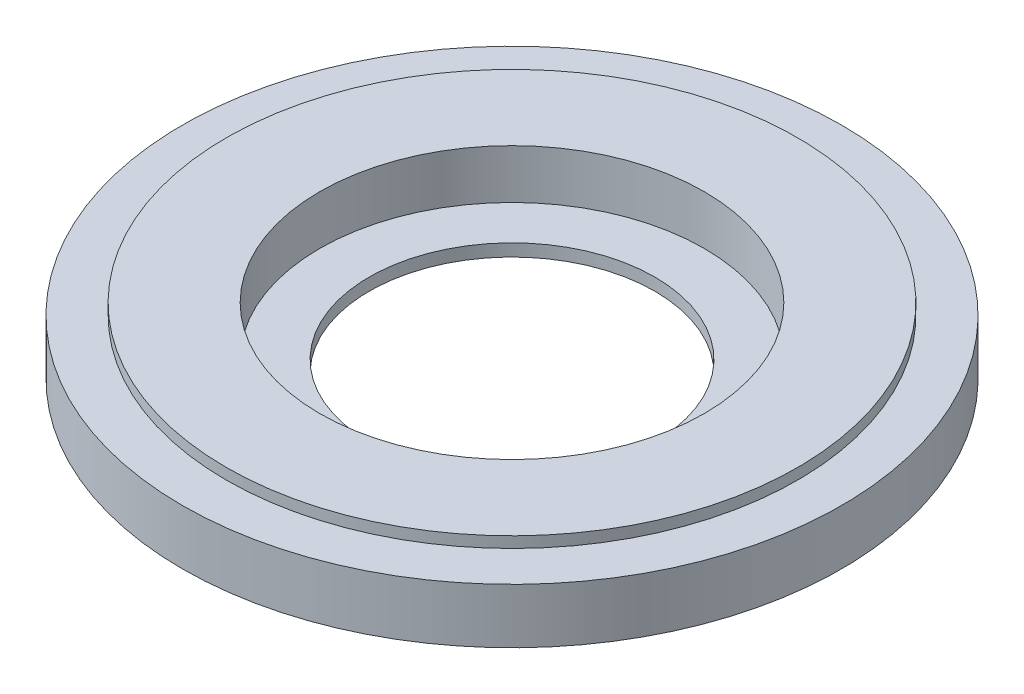
ISO-10303-21;
HEADER;
FILE_DESCRIPTION(('STEP AP214'),'2;1');
FILE_NAME('part.step','',(''),(''),'','','');
FILE_SCHEMA(('AUTOMOTIVE_DESIGN { 1 0 10303 214 1 1 1 1 }'));
ENDSEC;
DATA;
#1=APPLICATION_CONTEXT('core data for automotive mechanical design processes');
#2=APPLICATION_PROTOCOL_DEFINITION('international standard','automotive_design',2000,#1);
#3=PRODUCT_CONTEXT('',#1,'mechanical');
#4=PRODUCT('Part','Part','',(#3));
#5=PRODUCT_RELATED_PRODUCT_CATEGORY('part','',(#4));
#6=PRODUCT_DEFINITION_FORMATION('','',#4);
#7=PRODUCT_DEFINITION_CONTEXT('part definition',#1,'design');
#8=PRODUCT_DEFINITION('design','',#6,#7);
#9=PRODUCT_DEFINITION_SHAPE('','',#8);
#10=(LENGTH_UNIT() NAMED_UNIT(*) SI_UNIT(.MILLI.,.METRE.));
#11=(NAMED_UNIT(*) PLANE_ANGLE_UNIT() SI_UNIT($,.RADIAN.));
#12=(NAMED_UNIT(*) SI_UNIT($,.STERADIAN.) SOLID_ANGLE_UNIT());
#13=UNCERTAINTY_MEASURE_WITH_UNIT(LENGTH_MEASURE(1.E-05),#10,'distance_accuracy_value','');
#14=(GEOMETRIC_REPRESENTATION_CONTEXT(3) GLOBAL_UNCERTAINTY_ASSIGNED_CONTEXT((#13)) GLOBAL_UNIT_ASSIGNED_CONTEXT((#10,
#11,#12)) REPRESENTATION_CONTEXT('',''));
#15=CARTESIAN_POINT('',(0.,0.,0.));
#16=DIRECTION('',(0.,0.,1.));
#17=DIRECTION('',(1.,0.,0.));
#18=AXIS2_PLACEMENT_3D('',#15,#16,#17);
#19=CARTESIAN_POINT('',(0.,5.,0.));
#20=DIRECTION('',(0.,-1.,0.));
#21=DIRECTION('',(0.,0.,-1.));
#22=AXIS2_PLACEMENT_3D('',#19,#20,#21);
#23=CYLINDRICAL_SURFACE('',#22,30.);
#24=CARTESIAN_POINT('',(0.,5.,0.));
#25=DIRECTION('',(0.,1.,0.));
#26=DIRECTION('',(0.,0.,1.));
#27=AXIS2_PLACEMENT_3D('',#24,#25,#26);
#28=CIRCLE('',#27,30.);
#29=CARTESIAN_POINT('',(0.,5.,30.));
#30=VERTEX_POINT('',#29);
#31=EDGE_CURVE('E45',#30,#30,#28,.T.);
#32=ORIENTED_EDGE('',*,*,#31,.F.);
#33=EDGE_LOOP('',(#32));
#34=FACE_BOUND('',#33,.T.);
#35=CARTESIAN_POINT('',(0.,0.,0.));
#36=DIRECTION('',(0.,1.,0.));
#37=DIRECTION('',(0.,0.,1.));
#38=AXIS2_PLACEMENT_3D('',#35,#36,#37);
#39=CIRCLE('',#38,30.);
#40=CARTESIAN_POINT('',(0.,0.,30.));
#41=VERTEX_POINT('',#40);
#42=EDGE_CURVE('E51',#41,#41,#39,.T.);
#43=ORIENTED_EDGE('',*,*,#42,.T.);
#44=EDGE_LOOP('',(#43));
#45=FACE_BOUND('',#44,.T.);
#46=ADVANCED_FACE('F37',(#34,#45),#23,.T.);
#47=CARTESIAN_POINT('',(0.,5.,0.));
#48=DIRECTION('',(0.,1.,0.));
#49=DIRECTION('',(0.,0.,1.));
#50=AXIS2_PLACEMENT_3D('',#47,#48,#49);
#51=PLANE('',#50);
#52=CARTESIAN_POINT('',(0.,5.,0.));
#53=DIRECTION('',(0.,1.,0.));
#54=DIRECTION('',(0.,0.,1.));
#55=AXIS2_PLACEMENT_3D('',#52,#53,#54);
#56=CIRCLE('',#55,26.);
#57=CARTESIAN_POINT('',(0.,5.,26.));
#58=VERTEX_POINT('',#57);
#59=EDGE_CURVE('E10',#58,#58,#56,.T.);
#60=ORIENTED_EDGE('',*,*,#59,.F.);
#61=EDGE_LOOP('',(#60));
#62=FACE_BOUND('',#61,.T.);
#63=ORIENTED_EDGE('',*,*,#31,.T.);
#64=EDGE_LOOP('',(#63));
#65=FACE_BOUND('',#64,.T.);
#66=ADVANCED_FACE('F109',(#62,#65),#51,.T.);
#67=CARTESIAN_POINT('',(0.,0.,0.));
#68=DIRECTION('',(0.,1.,0.));
#69=DIRECTION('',(0.,0.,1.));
#70=AXIS2_PLACEMENT_3D('',#67,#68,#69);
#71=PLANE('',#70);
#72=CARTESIAN_POINT('',(0.,0.,0.));
#73=DIRECTION('',(0.,-1.,0.));
#74=DIRECTION('',(0.,0.,-1.));
#75=AXIS2_PLACEMENT_3D('',#72,#73,#74);
#76=CIRCLE('',#75,18.);
#77=CARTESIAN_POINT('',(0.,0.,-18.));
#78=VERTEX_POINT('',#77);
#79=EDGE_CURVE('E67',#78,#78,#76,.T.);
#80=ORIENTED_EDGE('',*,*,#79,.F.);
#81=EDGE_LOOP('',(#80));
#82=FACE_BOUND('',#81,.T.);
#83=ORIENTED_EDGE('',*,*,#42,.F.);
#84=EDGE_LOOP('',(#83));
#85=FACE_BOUND('',#84,.T.);
#86=ADVANCED_FACE('F114',(#82,#85),#71,.F.);
#87=CARTESIAN_POINT('',(0.,6.,0.));
#88=DIRECTION('',(0.,-1.,0.));
#89=DIRECTION('',(0.,0.,-1.));
#90=AXIS2_PLACEMENT_3D('',#87,#88,#89);
#91=CYLINDRICAL_SURFACE('',#90,26.);
#92=CARTESIAN_POINT('',(0.,6.,0.));
#93=DIRECTION('',(0.,1.,0.));
#94=DIRECTION('',(0.,0.,1.));
#95=AXIS2_PLACEMENT_3D('',#92,#93,#94);
#96=CIRCLE('',#95,26.);
#97=CARTESIAN_POINT('',(0.,6.,26.));
#98=VERTEX_POINT('',#97);
#99=EDGE_CURVE('E54',#98,#98,#96,.T.);
#100=ORIENTED_EDGE('',*,*,#99,.F.);
#101=EDGE_LOOP('',(#100));
#102=FACE_BOUND('',#101,.T.);
#103=ORIENTED_EDGE('',*,*,#59,.T.);
#104=EDGE_LOOP('',(#103));
#105=FACE_BOUND('',#104,.T.);
#106=ADVANCED_FACE('F122',(#102,#105),#91,.T.);
#107=CARTESIAN_POINT('',(0.,6.,0.));
#108=DIRECTION('',(0.,1.,0.));
#109=DIRECTION('',(0.,0.,1.));
#110=AXIS2_PLACEMENT_3D('',#107,#108,#109);
#111=PLANE('',#110);
#112=CARTESIAN_POINT('',(0.,6.,0.));
#113=DIRECTION('',(0.,1.,0.));
#114=DIRECTION('',(0.,0.,1.));
#115=AXIS2_PLACEMENT_3D('',#112,#113,#114);
#116=CIRCLE('',#115,17.5);
#117=CARTESIAN_POINT('',(0.,6.,17.5));
#118=VERTEX_POINT('',#117);
#119=EDGE_CURVE('E75',#118,#118,#116,.T.);
#120=ORIENTED_EDGE('',*,*,#119,.F.);
#121=EDGE_LOOP('',(#120));
#122=FACE_BOUND('',#121,.T.);
#123=ORIENTED_EDGE('',*,*,#99,.T.);
#124=EDGE_LOOP('',(#123));
#125=FACE_BOUND('',#124,.T.);
#126=ADVANCED_FACE('F105',(#122,#125),#111,.T.);
#127=CARTESIAN_POINT('',(0.,0.4,0.));
#128=DIRECTION('',(0.,-1.,0.));
#129=DIRECTION('',(0.,0.,-1.));
#130=AXIS2_PLACEMENT_3D('',#127,#128,#129);
#131=CYLINDRICAL_SURFACE('',#130,18.);
#132=CARTESIAN_POINT('',(0.,0.4,0.));
#133=DIRECTION('',(0.,-1.,0.));
#134=DIRECTION('',(0.,0.,-1.));
#135=AXIS2_PLACEMENT_3D('',#132,#133,#134);
#136=CIRCLE('',#135,18.);
#137=CARTESIAN_POINT('',(0.,0.4,-18.));
#138=VERTEX_POINT('',#137);
#139=EDGE_CURVE('E62',#138,#138,#136,.T.);
#140=ORIENTED_EDGE('',*,*,#139,.F.);
#141=EDGE_LOOP('',(#140));
#142=FACE_BOUND('',#141,.T.);
#143=ORIENTED_EDGE('',*,*,#79,.T.);
#144=EDGE_LOOP('',(#143));
#145=FACE_BOUND('',#144,.T.);
#146=ADVANCED_FACE('F96',(#142,#145),#131,.F.);
#147=CARTESIAN_POINT('',(0.,0.4,0.));
#148=DIRECTION('',(0.,-1.,0.));
#149=DIRECTION('',(0.,0.,-1.));
#150=AXIS2_PLACEMENT_3D('',#147,#148,#149);
#151=PLANE('',#150);
#152=CARTESIAN_POINT('',(0.,0.4,0.));
#153=DIRECTION('',(0.,-1.,0.));
#154=DIRECTION('',(0.,0.,-1.));
#155=AXIS2_PLACEMENT_3D('',#152,#153,#154);
#156=CIRCLE('',#155,13.);
#157=CARTESIAN_POINT('',(0.,0.4,-13.));
#158=VERTEX_POINT('',#157);
#159=EDGE_CURVE('E40',#158,#158,#156,.T.);
#160=ORIENTED_EDGE('',*,*,#159,.F.);
#161=EDGE_LOOP('',(#160));
#162=FACE_BOUND('',#161,.T.);
#163=ORIENTED_EDGE('',*,*,#139,.T.);
#164=EDGE_LOOP('',(#163));
#165=FACE_BOUND('',#164,.T.);
#166=ADVANCED_FACE('F93',(#162,#165),#151,.T.);
#167=CARTESIAN_POINT('',(0.,1.52,0.));
#168=DIRECTION('',(0.,1.,0.));
#169=DIRECTION('',(0.,0.,1.));
#170=AXIS2_PLACEMENT_3D('',#167,#168,#169);
#171=CYLINDRICAL_SURFACE('',#170,17.5);
#172=CARTESIAN_POINT('',(0.,1.52,0.));
#173=DIRECTION('',(0.,1.,0.));
#174=DIRECTION('',(0.,0.,1.));
#175=AXIS2_PLACEMENT_3D('',#172,#173,#174);
#176=CIRCLE('',#175,17.5);
#177=CARTESIAN_POINT('',(0.,1.52,17.5));
#178=VERTEX_POINT('',#177);
#179=EDGE_CURVE('E73',#178,#178,#176,.T.);
#180=ORIENTED_EDGE('',*,*,#179,.F.);
#181=EDGE_LOOP('',(#180));
#182=FACE_BOUND('',#181,.T.);
#183=ORIENTED_EDGE('',*,*,#119,.T.);
#184=EDGE_LOOP('',(#183));
#185=FACE_BOUND('',#184,.T.);
#186=ADVANCED_FACE('F95',(#182,#185),#171,.F.);
#187=CARTESIAN_POINT('',(0.,1.52,0.));
#188=DIRECTION('',(0.,1.,0.));
#189=DIRECTION('',(0.,0.,1.));
#190=AXIS2_PLACEMENT_3D('',#187,#188,#189);
#191=PLANE('',#190);
#192=CARTESIAN_POINT('',(0.,1.52,0.));
#193=DIRECTION('',(0.,1.,0.));
#194=DIRECTION('',(0.,0.,1.));
#195=AXIS2_PLACEMENT_3D('',#192,#193,#194);
#196=CIRCLE('',#195,13.);
#197=CARTESIAN_POINT('',(0.,1.52,13.));
#198=VERTEX_POINT('',#197);
#199=EDGE_CURVE('E82',#198,#198,#196,.T.);
#200=ORIENTED_EDGE('',*,*,#199,.F.);
#201=EDGE_LOOP('',(#200));
#202=FACE_BOUND('',#201,.T.);
#203=ORIENTED_EDGE('',*,*,#179,.T.);
#204=EDGE_LOOP('',(#203));
#205=FACE_BOUND('',#204,.T.);
#206=ADVANCED_FACE('F102',(#202,#205),#191,.T.);
#207=CARTESIAN_POINT('',(0.,0.,0.));
#208=DIRECTION('',(0.,1.,0.));
#209=DIRECTION('',(0.,0.,1.));
#210=AXIS2_PLACEMENT_3D('',#207,#208,#209);
#211=CYLINDRICAL_SURFACE('',#210,13.);
#212=ORIENTED_EDGE('',*,*,#159,.T.);
#213=EDGE_LOOP('',(#212));
#214=FACE_BOUND('',#213,.T.);
#215=ORIENTED_EDGE('',*,*,#199,.T.);
#216=EDGE_LOOP('',(#215));
#217=FACE_BOUND('',#216,.T.);
#218=ADVANCED_FACE('F91',(#214,#217),#211,.F.);
#219=CLOSED_SHELL('',(#46,#66,#86,#106,#126,#146,#166,#186,#206,#218));
#220=MANIFOLD_SOLID_BREP('B2',#219);
#221=ADVANCED_BREP_SHAPE_REPRESENTATION('',(#18,#220),#14);
#222=SHAPE_DEFINITION_REPRESENTATION(#9,#221);
ENDSEC;
END-ISO-10303-21;
